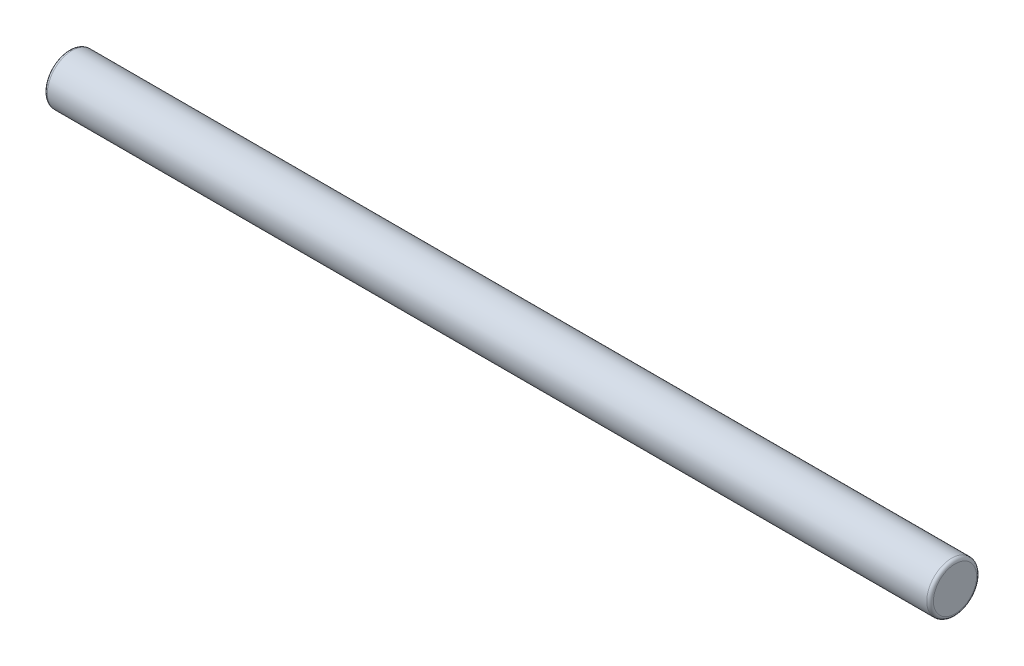
ISO-10303-21;
HEADER;
FILE_DESCRIPTION(('STEP AP214'),'2;1');
FILE_NAME('part.step','',(''),(''),'','','');
FILE_SCHEMA(('AUTOMOTIVE_DESIGN { 1 0 10303 214 1 1 1 1 }'));
ENDSEC;
DATA;
#1=APPLICATION_CONTEXT('core data for automotive mechanical design processes');
#2=APPLICATION_PROTOCOL_DEFINITION('international standard','automotive_design',2000,#1);
#3=PRODUCT_CONTEXT('',#1,'mechanical');
#4=PRODUCT('Part','Part','',(#3));
#5=PRODUCT_RELATED_PRODUCT_CATEGORY('part','',(#4));
#6=PRODUCT_DEFINITION_FORMATION('','',#4);
#7=PRODUCT_DEFINITION_CONTEXT('part definition',#1,'design');
#8=PRODUCT_DEFINITION('design','',#6,#7);
#9=PRODUCT_DEFINITION_SHAPE('','',#8);
#10=(LENGTH_UNIT() NAMED_UNIT(*) SI_UNIT(.MILLI.,.METRE.));
#11=(NAMED_UNIT(*) PLANE_ANGLE_UNIT() SI_UNIT($,.RADIAN.));
#12=(NAMED_UNIT(*) SI_UNIT($,.STERADIAN.) SOLID_ANGLE_UNIT());
#13=UNCERTAINTY_MEASURE_WITH_UNIT(LENGTH_MEASURE(1.E-05),#10,'distance_accuracy_value','');
#14=(GEOMETRIC_REPRESENTATION_CONTEXT(3) GLOBAL_UNCERTAINTY_ASSIGNED_CONTEXT((#13)) GLOBAL_UNIT_ASSIGNED_CONTEXT((#10,
#11,#12)) REPRESENTATION_CONTEXT('',''));
#15=CARTESIAN_POINT('',(0.,0.,0.));
#16=DIRECTION('',(0.,0.,1.));
#17=DIRECTION('',(1.,0.,0.));
#18=AXIS2_PLACEMENT_3D('',#15,#16,#17);
#19=CARTESIAN_POINT('',(40.,0.,0.));
#20=DIRECTION('',(-1.,0.,0.));
#21=DIRECTION('',(0.,0.,1.));
#22=AXIS2_PLACEMENT_3D('',#19,#20,#21);
#23=CYLINDRICAL_SURFACE('',#22,2.25);
#24=CARTESIAN_POINT('',(-39.7,0.,0.));
#25=DIRECTION('',(1.,0.,0.));
#26=DIRECTION('',(0.,0.,-1.));
#27=AXIS2_PLACEMENT_3D('',#24,#25,#26);
#28=CIRCLE('',#27,2.25);
#29=CARTESIAN_POINT('',(-39.7,0.,-2.25));
#30=VERTEX_POINT('',#29);
#31=EDGE_CURVE('E43',#30,#30,#28,.T.);
#32=ORIENTED_EDGE('',*,*,#31,.T.);
#33=EDGE_LOOP('',(#32));
#34=FACE_BOUND('',#33,.T.);
#35=CARTESIAN_POINT('',(39.7,0.,0.));
#36=DIRECTION('',(1.,0.,0.));
#37=DIRECTION('',(0.,0.,-1.));
#38=AXIS2_PLACEMENT_3D('',#35,#36,#37);
#39=CIRCLE('',#38,2.25);
#40=CARTESIAN_POINT('',(39.7,0.,-2.25));
#41=VERTEX_POINT('',#40);
#42=EDGE_CURVE('E47',#41,#41,#39,.F.);
#43=ORIENTED_EDGE('',*,*,#42,.T.);
#44=EDGE_LOOP('',(#43));
#45=FACE_BOUND('',#44,.T.);
#46=ADVANCED_FACE('F32',(#34,#45),#23,.T.);
#47=CARTESIAN_POINT('',(40.,0.,0.));
#48=DIRECTION('',(1.,0.,0.));
#49=DIRECTION('',(0.,0.,-1.));
#50=AXIS2_PLACEMENT_3D('',#47,#48,#49);
#51=PLANE('',#50);
#52=CARTESIAN_POINT('',(40.,0.,0.));
#53=DIRECTION('',(1.,0.,0.));
#54=DIRECTION('',(0.,0.,-1.));
#55=AXIS2_PLACEMENT_3D('',#52,#53,#54);
#56=CIRCLE('',#55,1.95);
#57=CARTESIAN_POINT('',(40.,0.,-1.95));
#58=VERTEX_POINT('',#57);
#59=EDGE_CURVE('E10',#58,#58,#56,.T.);
#60=ORIENTED_EDGE('',*,*,#59,.T.);
#61=EDGE_LOOP('',(#60));
#62=FACE_BOUND('',#61,.T.);
#63=ADVANCED_FACE('F63',(#62),#51,.T.);
#64=CARTESIAN_POINT('',(-40.,0.,0.));
#65=DIRECTION('',(1.,0.,0.));
#66=DIRECTION('',(0.,0.,-1.));
#67=AXIS2_PLACEMENT_3D('',#64,#65,#66);
#68=PLANE('',#67);
#69=CARTESIAN_POINT('',(-40.,0.,0.));
#70=DIRECTION('',(1.,0.,0.));
#71=DIRECTION('',(0.,0.,-1.));
#72=AXIS2_PLACEMENT_3D('',#69,#70,#71);
#73=CIRCLE('',#72,1.95);
#74=CARTESIAN_POINT('',(-40.,0.,-1.95));
#75=VERTEX_POINT('',#74);
#76=EDGE_CURVE('E39',#75,#75,#73,.F.);
#77=ORIENTED_EDGE('',*,*,#76,.T.);
#78=EDGE_LOOP('',(#77));
#79=FACE_BOUND('',#78,.T.);
#80=ADVANCED_FACE('F60',(#79),#68,.F.);
#81=CARTESIAN_POINT('',(-39.7,0.,0.));
#82=DIRECTION('',(1.,0.,0.));
#83=DIRECTION('',(0.,0.,-1.));
#84=AXIS2_PLACEMENT_3D('',#81,#82,#83);
#85=TOROIDAL_SURFACE('',#84,1.95,0.3);
#86=ORIENTED_EDGE('',*,*,#76,.F.);
#87=EDGE_LOOP('',(#86));
#88=FACE_BOUND('',#87,.T.);
#89=ORIENTED_EDGE('',*,*,#31,.F.);
#90=EDGE_LOOP('',(#89));
#91=FACE_BOUND('',#90,.T.);
#92=ADVANCED_FACE('F56',(#88,#91),#85,.T.);
#93=CARTESIAN_POINT('',(39.7,0.,0.));
#94=DIRECTION('',(1.,0.,0.));
#95=DIRECTION('',(0.,0.,-1.));
#96=AXIS2_PLACEMENT_3D('',#93,#94,#95);
#97=TOROIDAL_SURFACE('',#96,1.95,0.3);
#98=ORIENTED_EDGE('',*,*,#42,.F.);
#99=EDGE_LOOP('',(#98));
#100=FACE_BOUND('',#99,.T.);
#101=ORIENTED_EDGE('',*,*,#59,.F.);
#102=EDGE_LOOP('',(#101));
#103=FACE_BOUND('',#102,.T.);
#104=ADVANCED_FACE('F34',(#100,#103),#97,.T.);
#105=CLOSED_SHELL('',(#46,#63,#80,#92,#104));
#106=MANIFOLD_SOLID_BREP('B2',#105);
#107=ADVANCED_BREP_SHAPE_REPRESENTATION('',(#18,#106),#14);
#108=SHAPE_DEFINITION_REPRESENTATION(#9,#107);
ENDSEC;
END-ISO-10303-21;
